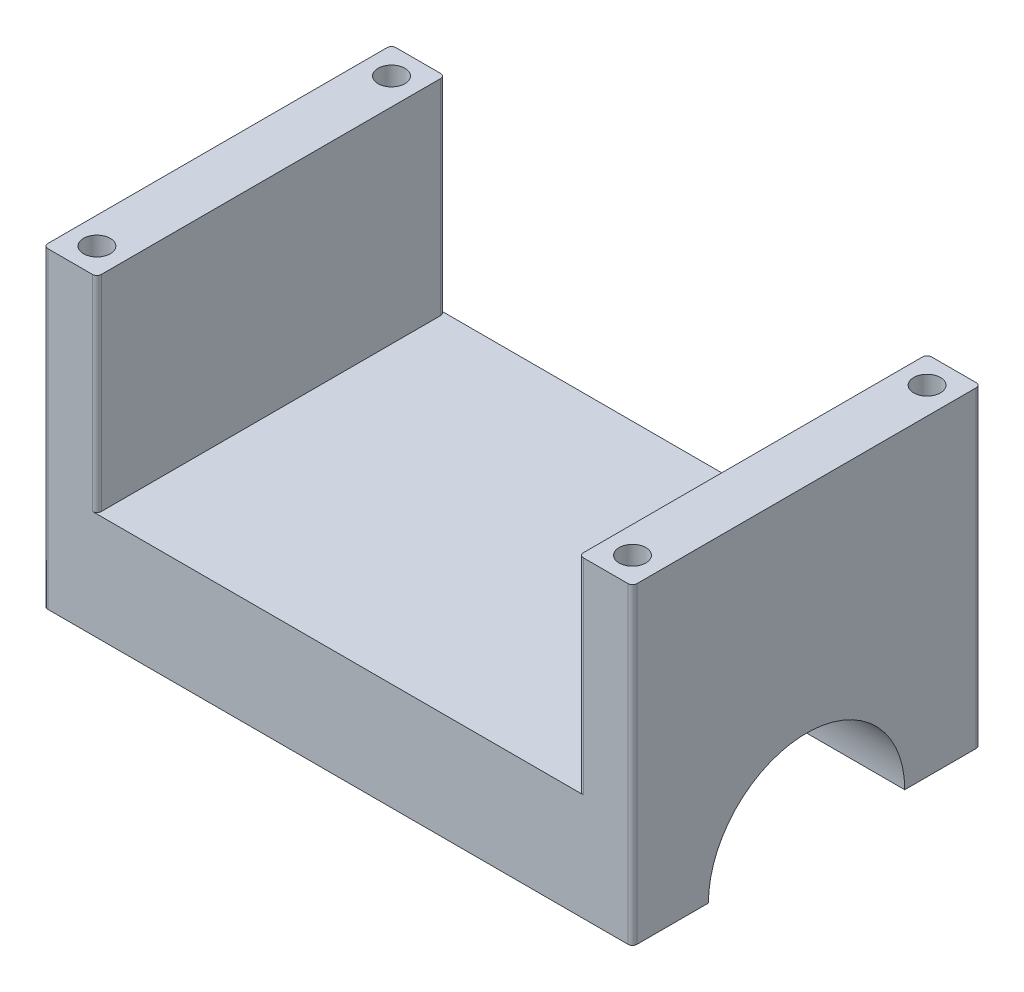
ISO-10303-21;
HEADER;
FILE_DESCRIPTION(('STEP AP214'),'2;1');
FILE_NAME('part.step','',(''),(''),'','','');
FILE_SCHEMA(('AUTOMOTIVE_DESIGN { 1 0 10303 214 1 1 1 1 }'));
ENDSEC;
DATA;
#1=APPLICATION_CONTEXT('core data for automotive mechanical design processes');
#2=APPLICATION_PROTOCOL_DEFINITION('international standard','automotive_design',2000,#1);
#3=PRODUCT_CONTEXT('',#1,'mechanical');
#4=PRODUCT('Part','Part','',(#3));
#5=PRODUCT_RELATED_PRODUCT_CATEGORY('part','',(#4));
#6=PRODUCT_DEFINITION_FORMATION('','',#4);
#7=PRODUCT_DEFINITION_CONTEXT('part definition',#1,'design');
#8=PRODUCT_DEFINITION('design','',#6,#7);
#9=PRODUCT_DEFINITION_SHAPE('','',#8);
#10=(LENGTH_UNIT() NAMED_UNIT(*) SI_UNIT(.MILLI.,.METRE.));
#11=(NAMED_UNIT(*) PLANE_ANGLE_UNIT() SI_UNIT($,.RADIAN.));
#12=(NAMED_UNIT(*) SI_UNIT($,.STERADIAN.) SOLID_ANGLE_UNIT());
#13=UNCERTAINTY_MEASURE_WITH_UNIT(LENGTH_MEASURE(1.E-05),#10,'distance_accuracy_value','');
#14=(GEOMETRIC_REPRESENTATION_CONTEXT(3) GLOBAL_UNCERTAINTY_ASSIGNED_CONTEXT((#13)) GLOBAL_UNIT_ASSIGNED_CONTEXT((#10,
#11,#12)) REPRESENTATION_CONTEXT('',''));
#15=CARTESIAN_POINT('',(0.,0.,0.));
#16=DIRECTION('',(0.,0.,1.));
#17=DIRECTION('',(1.,0.,0.));
#18=AXIS2_PLACEMENT_3D('',#15,#16,#17);
#19=CARTESIAN_POINT('',(0.,0.,0.));
#20=DIRECTION('',(0.,-1.,0.));
#21=DIRECTION('',(0.,0.,-1.));
#22=AXIS2_PLACEMENT_3D('',#19,#20,#21);
#23=PLANE('',#22);
#24=CARTESIAN_POINT('',(3.,0.,-36.));
#25=DIRECTION('',(0.,1.,0.));
#26=DIRECTION('',(0.,0.,1.));
#27=AXIS2_PLACEMENT_3D('',#24,#25,#26);
#28=CIRCLE('',#27,1.5);
#29=CARTESIAN_POINT('',(3.,0.,-34.5));
#30=VERTEX_POINT('',#29);
#31=EDGE_CURVE('E337',#30,#30,#28,.T.);
#32=ORIENTED_EDGE('',*,*,#31,.T.);
#33=EDGE_LOOP('',(#32));
#34=FACE_BOUND('',#33,.T.);
#35=CARTESIAN_POINT('',(63.,0.,-36.));
#36=DIRECTION('',(0.,1.,0.));
#37=DIRECTION('',(0.,0.,1.));
#38=AXIS2_PLACEMENT_3D('',#35,#36,#37);
#39=CIRCLE('',#38,1.5);
#40=CARTESIAN_POINT('',(63.,0.,-34.5));
#41=VERTEX_POINT('',#40);
#42=EDGE_CURVE('E343',#41,#41,#39,.T.);
#43=ORIENTED_EDGE('',*,*,#42,.T.);
#44=EDGE_LOOP('',(#43));
#45=FACE_BOUND('',#44,.T.);
#46=DIRECTION('',(-1.,0.,0.));
#47=VECTOR('',#46,1.);
#48=CARTESIAN_POINT('',(0.,0.,-39.));
#49=LINE('',#48,#47);
#50=CARTESIAN_POINT('',(65.5,0.,-39.));
#51=VERTEX_POINT('',#50);
#52=CARTESIAN_POINT('',(0.499999999999983,0.,-39.));
#53=VERTEX_POINT('',#52);
#54=EDGE_CURVE('E194',#51,#53,#49,.T.);
#55=ORIENTED_EDGE('',*,*,#54,.F.);
#56=CARTESIAN_POINT('',(65.5,0.,-38.5));
#57=DIRECTION('',(0.,-1.,0.));
#58=DIRECTION('',(0.,0.,-1.));
#59=AXIS2_PLACEMENT_3D('',#56,#57,#58);
#60=CIRCLE('',#59,0.5);
#61=CARTESIAN_POINT('',(66.,0.,-38.5));
#62=VERTEX_POINT('',#61);
#63=EDGE_CURVE('E191',#51,#62,#60,.T.);
#64=ORIENTED_EDGE('',*,*,#63,.T.);
#65=DIRECTION('',(0.,0.,-1.));
#66=VECTOR('',#65,1.);
#67=CARTESIAN_POINT('',(66.,0.,0.));
#68=LINE('',#67,#66);
#69=CARTESIAN_POINT('',(66.,0.,-30.5));
#70=VERTEX_POINT('',#69);
#71=EDGE_CURVE('E183',#70,#62,#68,.T.);
#72=ORIENTED_EDGE('',*,*,#71,.F.);
#73=DIRECTION('',(1.,0.,0.));
#74=VECTOR('',#73,1.);
#75=CARTESIAN_POINT('',(0.,0.,-30.5));
#76=LINE('',#75,#74);
#77=CARTESIAN_POINT('',(0.,0.,-30.5));
#78=VERTEX_POINT('',#77);
#79=EDGE_CURVE('E167',#78,#70,#76,.T.);
#80=ORIENTED_EDGE('',*,*,#79,.F.);
#81=DIRECTION('',(0.,0.,1.));
#82=VECTOR('',#81,1.);
#83=CARTESIAN_POINT('',(0.,0.,0.));
#84=LINE('',#83,#82);
#85=CARTESIAN_POINT('',(0.,0.,-38.5));
#86=VERTEX_POINT('',#85);
#87=EDGE_CURVE('E196',#86,#78,#84,.T.);
#88=ORIENTED_EDGE('',*,*,#87,.F.);
#89=CARTESIAN_POINT('',(0.499999999999983,0.,-38.5));
#90=DIRECTION('',(0.,-1.,0.));
#91=DIRECTION('',(0.,0.,-1.));
#92=AXIS2_PLACEMENT_3D('',#89,#90,#91);
#93=CIRCLE('',#92,0.5);
#94=EDGE_CURVE('E228',#86,#53,#93,.T.);
#95=ORIENTED_EDGE('',*,*,#94,.T.);
#96=EDGE_LOOP('',(#55,#64,#72,#80,#88,#95));
#97=FACE_BOUND('',#96,.T.);
#98=ADVANCED_FACE('F39',(#34,#45,#97),#23,.T.);
#99=CARTESIAN_POINT('',(0.,35.,0.));
#100=DIRECTION('',(0.,-1.,0.));
#101=DIRECTION('',(0.,0.,-1.));
#102=AXIS2_PLACEMENT_3D('',#99,#100,#101);
#103=PLANE('',#102);
#104=CARTESIAN_POINT('',(63.,35.,-36.));
#105=DIRECTION('',(0.,1.,0.));
#106=DIRECTION('',(0.,0.,1.));
#107=AXIS2_PLACEMENT_3D('',#104,#105,#106);
#108=CIRCLE('',#107,1.5);
#109=CARTESIAN_POINT('',(63.,35.,-34.5));
#110=VERTEX_POINT('',#109);
#111=EDGE_CURVE('E346',#110,#110,#108,.T.);
#112=ORIENTED_EDGE('',*,*,#111,.F.);
#113=EDGE_LOOP('',(#112));
#114=FACE_BOUND('',#113,.T.);
#115=CARTESIAN_POINT('',(63.,35.,-3.));
#116=DIRECTION('',(0.,1.,0.));
#117=DIRECTION('',(0.,0.,1.));
#118=AXIS2_PLACEMENT_3D('',#115,#116,#117);
#119=CIRCLE('',#118,1.5);
#120=CARTESIAN_POINT('',(63.,35.,-1.5));
#121=VERTEX_POINT('',#120);
#122=EDGE_CURVE('E334',#121,#121,#119,.T.);
#123=ORIENTED_EDGE('',*,*,#122,.F.);
#124=EDGE_LOOP('',(#123));
#125=FACE_BOUND('',#124,.T.);
#126=DIRECTION('',(-1.,0.,0.));
#127=VECTOR('',#126,1.);
#128=CARTESIAN_POINT('',(0.,35.,-39.));
#129=LINE('',#128,#127);
#130=CARTESIAN_POINT('',(65.5,35.,-39.));
#131=VERTEX_POINT('',#130);
#132=CARTESIAN_POINT('',(60.5,35.,-39.));
#133=VERTEX_POINT('',#132);
#134=EDGE_CURVE('E203',#131,#133,#129,.T.);
#135=ORIENTED_EDGE('',*,*,#134,.T.);
#136=CARTESIAN_POINT('',(60.5,35.,-38.5));
#137=DIRECTION('',(0.,-1.,0.));
#138=DIRECTION('',(0.,0.,-1.));
#139=AXIS2_PLACEMENT_3D('',#136,#137,#138);
#140=CIRCLE('',#139,0.5);
#141=CARTESIAN_POINT('',(60.,35.,-38.5));
#142=VERTEX_POINT('',#141);
#143=EDGE_CURVE('E221',#133,#142,#140,.F.);
#144=ORIENTED_EDGE('',*,*,#143,.T.);
#145=DIRECTION('',(0.,0.,-1.));
#146=VECTOR('',#145,1.);
#147=CARTESIAN_POINT('',(60.,35.,0.));
#148=LINE('',#147,#146);
#149=CARTESIAN_POINT('',(60.,35.,-0.5));
#150=VERTEX_POINT('',#149);
#151=EDGE_CURVE('E326',#150,#142,#148,.T.);
#152=ORIENTED_EDGE('',*,*,#151,.F.);
#153=CARTESIAN_POINT('',(60.5,35.,-0.5));
#154=DIRECTION('',(0.,-1.,0.));
#155=DIRECTION('',(0.,0.,-1.));
#156=AXIS2_PLACEMENT_3D('',#153,#154,#155);
#157=CIRCLE('',#156,0.5);
#158=CARTESIAN_POINT('',(60.5,35.,0.));
#159=VERTEX_POINT('',#158);
#160=EDGE_CURVE('E215',#150,#159,#157,.F.);
#161=ORIENTED_EDGE('',*,*,#160,.T.);
#162=DIRECTION('',(1.,0.,0.));
#163=VECTOR('',#162,1.);
#164=CARTESIAN_POINT('',(0.,35.,0.));
#165=LINE('',#164,#163);
#166=CARTESIAN_POINT('',(65.5,35.,0.));
#167=VERTEX_POINT('',#166);
#168=EDGE_CURVE('E316',#159,#167,#165,.T.);
#169=ORIENTED_EDGE('',*,*,#168,.T.);
#170=CARTESIAN_POINT('',(65.5,35.,-0.5));
#171=DIRECTION('',(0.,-1.,0.));
#172=DIRECTION('',(0.,0.,-1.));
#173=AXIS2_PLACEMENT_3D('',#170,#171,#172);
#174=CIRCLE('',#173,0.5);
#175=CARTESIAN_POINT('',(66.,35.,-0.5));
#176=VERTEX_POINT('',#175);
#177=EDGE_CURVE('E217',#167,#176,#174,.F.);
#178=ORIENTED_EDGE('',*,*,#177,.T.);
#179=DIRECTION('',(0.,0.,-1.));
#180=VECTOR('',#179,1.);
#181=CARTESIAN_POINT('',(66.,35.,0.));
#182=LINE('',#181,#180);
#183=CARTESIAN_POINT('',(66.,35.,-38.5));
#184=VERTEX_POINT('',#183);
#185=EDGE_CURVE('E296',#176,#184,#182,.T.);
#186=ORIENTED_EDGE('',*,*,#185,.T.);
#187=CARTESIAN_POINT('',(65.5,35.,-38.5));
#188=DIRECTION('',(0.,-1.,0.));
#189=DIRECTION('',(0.,0.,-1.));
#190=AXIS2_PLACEMENT_3D('',#187,#188,#189);
#191=CIRCLE('',#190,0.5);
#192=EDGE_CURVE('E219',#184,#131,#191,.F.);
#193=ORIENTED_EDGE('',*,*,#192,.T.);
#194=EDGE_LOOP('',(#135,#144,#152,#161,#169,#178,#186,#193));
#195=FACE_BOUND('',#194,.T.);
#196=ADVANCED_FACE('F357',(#114,#125,#195),#103,.F.);
#197=CARTESIAN_POINT('',(0.,35.,0.));
#198=DIRECTION('',(1.,0.,0.));
#199=DIRECTION('',(0.,0.,-1.));
#200=AXIS2_PLACEMENT_3D('',#197,#198,#199);
#201=PLANE('',#200);
#202=CARTESIAN_POINT('',(0.,0.,-8.50000000000001));
#203=VERTEX_POINT('',#202);
#204=CARTESIAN_POINT('',(0.,0.,-0.5));
#205=VERTEX_POINT('',#204);
#206=EDGE_CURVE('E286',#203,#205,#84,.T.);
#207=ORIENTED_EDGE('',*,*,#206,.T.);
#208=DIRECTION('',(0.,-1.,0.));
#209=VECTOR('',#208,1.);
#210=CARTESIAN_POINT('',(0.,35.,-0.5));
#211=LINE('',#210,#209);
#212=CARTESIAN_POINT('',(0.,35.,-0.5));
#213=VERTEX_POINT('',#212);
#214=EDGE_CURVE('E54',#205,#213,#211,.F.);
#215=ORIENTED_EDGE('',*,*,#214,.T.);
#216=DIRECTION('',(0.,0.,1.));
#217=VECTOR('',#216,1.);
#218=CARTESIAN_POINT('',(0.,35.,0.));
#219=LINE('',#218,#217);
#220=CARTESIAN_POINT('',(0.,35.,-38.5));
#221=VERTEX_POINT('',#220);
#222=EDGE_CURVE('E202',#221,#213,#219,.T.);
#223=ORIENTED_EDGE('',*,*,#222,.F.);
#224=DIRECTION('',(0.,-1.,0.));
#225=VECTOR('',#224,1.);
#226=CARTESIAN_POINT('',(0.,35.,-38.5));
#227=LINE('',#226,#225);
#228=EDGE_CURVE('E262',#221,#86,#227,.T.);
#229=ORIENTED_EDGE('',*,*,#228,.T.);
#230=ORIENTED_EDGE('',*,*,#87,.T.);
#231=CARTESIAN_POINT('',(0.,0.,-19.5));
#232=DIRECTION('',(1.,0.,0.));
#233=DIRECTION('',(0.,0.,-1.));
#234=AXIS2_PLACEMENT_3D('',#231,#232,#233);
#235=CIRCLE('',#234,11.);
#236=EDGE_CURVE('E173',#78,#203,#235,.T.);
#237=ORIENTED_EDGE('',*,*,#236,.T.);
#238=EDGE_LOOP('',(#207,#215,#223,#229,#230,#237));
#239=FACE_BOUND('',#238,.T.);
#240=ADVANCED_FACE('F304',(#239),#201,.F.);
#241=CARTESIAN_POINT('',(0.,35.,0.));
#242=DIRECTION('',(0.,0.,-1.));
#243=DIRECTION('',(-1.,0.,0.));
#244=AXIS2_PLACEMENT_3D('',#241,#242,#243);
#245=PLANE('',#244);
#246=DIRECTION('',(1.,0.,0.));
#247=VECTOR('',#246,1.);
#248=CARTESIAN_POINT('',(0.,0.,0.));
#249=LINE('',#248,#247);
#250=CARTESIAN_POINT('',(0.5,0.,0.));
#251=VERTEX_POINT('',#250);
#252=CARTESIAN_POINT('',(65.5,0.,0.));
#253=VERTEX_POINT('',#252);
#254=EDGE_CURVE('E192',#251,#253,#249,.T.);
#255=ORIENTED_EDGE('',*,*,#254,.T.);
#256=DIRECTION('',(0.,-1.,0.));
#257=VECTOR('',#256,1.);
#258=CARTESIAN_POINT('',(65.5,35.,0.));
#259=LINE('',#258,#257);
#260=EDGE_CURVE('E248',#253,#167,#259,.F.);
#261=ORIENTED_EDGE('',*,*,#260,.T.);
#262=ORIENTED_EDGE('',*,*,#168,.F.);
#263=DIRECTION('',(0.,1.,0.));
#264=VECTOR('',#263,1.);
#265=CARTESIAN_POINT('',(60.5,35.,0.));
#266=LINE('',#265,#264);
#267=CARTESIAN_POINT('',(60.5,12.,0.));
#268=VERTEX_POINT('',#267);
#269=EDGE_CURVE('E245',#159,#268,#266,.F.);
#270=ORIENTED_EDGE('',*,*,#269,.T.);
#271=DIRECTION('',(1.,0.,0.));
#272=VECTOR('',#271,1.);
#273=CARTESIAN_POINT('',(6.,12.,0.));
#274=LINE('',#273,#272);
#275=CARTESIAN_POINT('',(5.5,12.,0.));
#276=VERTEX_POINT('',#275);
#277=EDGE_CURVE('E323',#276,#268,#274,.T.);
#278=ORIENTED_EDGE('',*,*,#277,.F.);
#279=DIRECTION('',(0.,1.,0.));
#280=VECTOR('',#279,1.);
#281=CARTESIAN_POINT('',(5.5,35.,0.));
#282=LINE('',#281,#280);
#283=CARTESIAN_POINT('',(5.5,35.,0.));
#284=VERTEX_POINT('',#283);
#285=EDGE_CURVE('E242',#276,#284,#282,.T.);
#286=ORIENTED_EDGE('',*,*,#285,.T.);
#287=CARTESIAN_POINT('',(0.5,35.,0.));
#288=VERTEX_POINT('',#287);
#289=EDGE_CURVE('E300',#288,#284,#165,.T.);
#290=ORIENTED_EDGE('',*,*,#289,.F.);
#291=DIRECTION('',(0.,-1.,0.));
#292=VECTOR('',#291,1.);
#293=CARTESIAN_POINT('',(0.5,35.,0.));
#294=LINE('',#293,#292);
#295=EDGE_CURVE('E239',#288,#251,#294,.T.);
#296=ORIENTED_EDGE('',*,*,#295,.T.);
#297=EDGE_LOOP('',(#255,#261,#262,#270,#278,#286,#290,#296));
#298=FACE_BOUND('',#297,.T.);
#299=ADVANCED_FACE('F313',(#298),#245,.F.);
#300=CARTESIAN_POINT('',(66.,35.,0.));
#301=DIRECTION('',(-1.,0.,0.));
#302=DIRECTION('',(0.,0.,1.));
#303=AXIS2_PLACEMENT_3D('',#300,#301,#302);
#304=PLANE('',#303);
#305=ORIENTED_EDGE('',*,*,#71,.T.);
#306=DIRECTION('',(0.,-1.,0.));
#307=VECTOR('',#306,1.);
#308=CARTESIAN_POINT('',(66.,35.,-38.5));
#309=LINE('',#308,#307);
#310=EDGE_CURVE('E233',#62,#184,#309,.F.);
#311=ORIENTED_EDGE('',*,*,#310,.T.);
#312=ORIENTED_EDGE('',*,*,#185,.F.);
#313=DIRECTION('',(0.,-1.,0.));
#314=VECTOR('',#313,1.);
#315=CARTESIAN_POINT('',(66.,35.,-0.5));
#316=LINE('',#315,#314);
#317=CARTESIAN_POINT('',(66.,0.,-0.5));
#318=VERTEX_POINT('',#317);
#319=EDGE_CURVE('E231',#176,#318,#316,.T.);
#320=ORIENTED_EDGE('',*,*,#319,.T.);
#321=CARTESIAN_POINT('',(66.,0.,-8.50000000000001));
#322=VERTEX_POINT('',#321);
#323=EDGE_CURVE('E187',#318,#322,#68,.T.);
#324=ORIENTED_EDGE('',*,*,#323,.T.);
#325=CARTESIAN_POINT('',(66.,0.,-19.5));
#326=DIRECTION('',(1.,0.,0.));
#327=DIRECTION('',(0.,0.,-1.));
#328=AXIS2_PLACEMENT_3D('',#325,#326,#327);
#329=CIRCLE('',#328,11.);
#330=EDGE_CURVE('E170',#70,#322,#329,.T.);
#331=ORIENTED_EDGE('',*,*,#330,.F.);
#332=EDGE_LOOP('',(#305,#311,#312,#320,#324,#331));
#333=FACE_BOUND('',#332,.T.);
#334=ADVANCED_FACE('F182',(#333),#304,.F.);
#335=CARTESIAN_POINT('',(0.,35.,-39.));
#336=DIRECTION('',(0.,0.,1.));
#337=DIRECTION('',(1.,0.,0.));
#338=AXIS2_PLACEMENT_3D('',#335,#336,#337);
#339=PLANE('',#338);
#340=DIRECTION('',(-1.,0.,0.));
#341=VECTOR('',#340,1.);
#342=CARTESIAN_POINT('',(6.,12.,-39.));
#343=LINE('',#342,#341);
#344=CARTESIAN_POINT('',(60.5,12.,-39.));
#345=VERTEX_POINT('',#344);
#346=CARTESIAN_POINT('',(5.5,12.,-39.));
#347=VERTEX_POINT('',#346);
#348=EDGE_CURVE('E277',#345,#347,#343,.T.);
#349=ORIENTED_EDGE('',*,*,#348,.F.);
#350=DIRECTION('',(0.,1.,0.));
#351=VECTOR('',#350,1.);
#352=CARTESIAN_POINT('',(60.5,35.,-39.));
#353=LINE('',#352,#351);
#354=EDGE_CURVE('E212',#345,#133,#353,.T.);
#355=ORIENTED_EDGE('',*,*,#354,.T.);
#356=ORIENTED_EDGE('',*,*,#134,.F.);
#357=DIRECTION('',(0.,-1.,0.));
#358=VECTOR('',#357,1.);
#359=CARTESIAN_POINT('',(65.5,35.,-39.));
#360=LINE('',#359,#358);
#361=EDGE_CURVE('E209',#131,#51,#360,.T.);
#362=ORIENTED_EDGE('',*,*,#361,.T.);
#363=ORIENTED_EDGE('',*,*,#54,.T.);
#364=DIRECTION('',(0.,-1.,0.));
#365=VECTOR('',#364,1.);
#366=CARTESIAN_POINT('',(0.499999999999983,35.,-39.));
#367=LINE('',#366,#365);
#368=CARTESIAN_POINT('',(0.499999999999983,35.,-39.));
#369=VERTEX_POINT('',#368);
#370=EDGE_CURVE('E177',#53,#369,#367,.F.);
#371=ORIENTED_EDGE('',*,*,#370,.T.);
#372=CARTESIAN_POINT('',(5.5,35.,-39.));
#373=VERTEX_POINT('',#372);
#374=EDGE_CURVE('E291',#373,#369,#129,.T.);
#375=ORIENTED_EDGE('',*,*,#374,.F.);
#376=DIRECTION('',(0.,1.,0.));
#377=VECTOR('',#376,1.);
#378=CARTESIAN_POINT('',(5.5,35.,-39.));
#379=LINE('',#378,#377);
#380=EDGE_CURVE('E206',#373,#347,#379,.F.);
#381=ORIENTED_EDGE('',*,*,#380,.T.);
#382=EDGE_LOOP('',(#349,#355,#356,#362,#363,#371,#375,#381));
#383=FACE_BOUND('',#382,.T.);
#384=ADVANCED_FACE('F294',(#383),#339,.F.);
#385=CARTESIAN_POINT('',(3.,35.,-36.));
#386=DIRECTION('',(0.,1.,0.));
#387=DIRECTION('',(0.,0.,1.));
#388=AXIS2_PLACEMENT_3D('',#385,#386,#387);
#389=CIRCLE('',#388,1.5);
#390=CARTESIAN_POINT('',(3.,35.,-34.5));
#391=VERTEX_POINT('',#390);
#392=EDGE_CURVE('E340',#391,#391,#389,.T.);
#393=ORIENTED_EDGE('',*,*,#392,.F.);
#394=EDGE_LOOP('',(#393));
#395=FACE_BOUND('',#394,.T.);
#396=CARTESIAN_POINT('',(3.,35.,-3.));
#397=DIRECTION('',(0.,1.,0.));
#398=DIRECTION('',(0.,0.,1.));
#399=AXIS2_PLACEMENT_3D('',#396,#397,#398);
#400=CIRCLE('',#399,1.5);
#401=CARTESIAN_POINT('',(3.,35.,-1.5));
#402=VERTEX_POINT('',#401);
#403=EDGE_CURVE('E331',#402,#402,#400,.T.);
#404=ORIENTED_EDGE('',*,*,#403,.F.);
#405=EDGE_LOOP('',(#404));
#406=FACE_BOUND('',#405,.T.);
#407=DIRECTION('',(0.,0.,1.));
#408=VECTOR('',#407,1.);
#409=CARTESIAN_POINT('',(6.,35.,0.));
#410=LINE('',#409,#408);
#411=CARTESIAN_POINT('',(6.,35.,-38.5));
#412=VERTEX_POINT('',#411);
#413=CARTESIAN_POINT('',(6.,35.,-0.5));
#414=VERTEX_POINT('',#413);
#415=EDGE_CURVE('E292',#412,#414,#410,.T.);
#416=ORIENTED_EDGE('',*,*,#415,.F.);
#417=CARTESIAN_POINT('',(5.5,35.,-38.5));
#418=DIRECTION('',(0.,-1.,0.));
#419=DIRECTION('',(0.,0.,-1.));
#420=AXIS2_PLACEMENT_3D('',#417,#418,#419);
#421=CIRCLE('',#420,0.5);
#422=EDGE_CURVE('E260',#412,#373,#421,.F.);
#423=ORIENTED_EDGE('',*,*,#422,.T.);
#424=ORIENTED_EDGE('',*,*,#374,.T.);
#425=CARTESIAN_POINT('',(0.499999999999983,35.,-38.5));
#426=DIRECTION('',(0.,-1.,0.));
#427=DIRECTION('',(0.,0.,-1.));
#428=AXIS2_PLACEMENT_3D('',#425,#426,#427);
#429=CIRCLE('',#428,0.5);
#430=EDGE_CURVE('E61',#369,#221,#429,.F.);
#431=ORIENTED_EDGE('',*,*,#430,.T.);
#432=ORIENTED_EDGE('',*,*,#222,.T.);
#433=CARTESIAN_POINT('',(0.5,35.,-0.5));
#434=DIRECTION('',(0.,-1.,0.));
#435=DIRECTION('',(0.,0.,-1.));
#436=AXIS2_PLACEMENT_3D('',#433,#434,#435);
#437=CIRCLE('',#436,0.5);
#438=EDGE_CURVE('E256',#213,#288,#437,.F.);
#439=ORIENTED_EDGE('',*,*,#438,.T.);
#440=ORIENTED_EDGE('',*,*,#289,.T.);
#441=CARTESIAN_POINT('',(5.5,35.,-0.5));
#442=DIRECTION('',(0.,-1.,0.));
#443=DIRECTION('',(0.,0.,-1.));
#444=AXIS2_PLACEMENT_3D('',#441,#442,#443);
#445=CIRCLE('',#444,0.5);
#446=EDGE_CURVE('E258',#284,#414,#445,.F.);
#447=ORIENTED_EDGE('',*,*,#446,.T.);
#448=EDGE_LOOP('',(#416,#423,#424,#431,#432,#439,#440,#447));
#449=FACE_BOUND('',#448,.T.);
#450=ADVANCED_FACE('F290',(#395,#406,#449),#103,.F.);
#451=CARTESIAN_POINT('',(63.,0.,-3.));
#452=DIRECTION('',(0.,1.,0.));
#453=DIRECTION('',(0.,0.,1.));
#454=AXIS2_PLACEMENT_3D('',#451,#452,#453);
#455=CIRCLE('',#454,1.5);
#456=CARTESIAN_POINT('',(63.,0.,-1.5));
#457=VERTEX_POINT('',#456);
#458=EDGE_CURVE('E349',#457,#457,#455,.T.);
#459=ORIENTED_EDGE('',*,*,#458,.T.);
#460=EDGE_LOOP('',(#459));
#461=FACE_BOUND('',#460,.T.);
#462=CARTESIAN_POINT('',(3.,0.,-3.));
#463=DIRECTION('',(0.,1.,0.));
#464=DIRECTION('',(0.,0.,1.));
#465=AXIS2_PLACEMENT_3D('',#462,#463,#464);
#466=CIRCLE('',#465,1.5);
#467=CARTESIAN_POINT('',(3.,0.,-1.5));
#468=VERTEX_POINT('',#467);
#469=EDGE_CURVE('E188',#468,#468,#466,.T.);
#470=ORIENTED_EDGE('',*,*,#469,.T.);
#471=EDGE_LOOP('',(#470));
#472=FACE_BOUND('',#471,.T.);
#473=ORIENTED_EDGE('',*,*,#323,.F.);
#474=CARTESIAN_POINT('',(65.5,0.,-0.5));
#475=DIRECTION('',(0.,-1.,0.));
#476=DIRECTION('',(0.,0.,-1.));
#477=AXIS2_PLACEMENT_3D('',#474,#475,#476);
#478=CIRCLE('',#477,0.5);
#479=EDGE_CURVE('E237',#318,#253,#478,.T.);
#480=ORIENTED_EDGE('',*,*,#479,.T.);
#481=ORIENTED_EDGE('',*,*,#254,.F.);
#482=CARTESIAN_POINT('',(0.5,0.,-0.5));
#483=DIRECTION('',(0.,-1.,0.));
#484=DIRECTION('',(0.,0.,-1.));
#485=AXIS2_PLACEMENT_3D('',#482,#483,#484);
#486=CIRCLE('',#485,0.5);
#487=EDGE_CURVE('E235',#251,#205,#486,.T.);
#488=ORIENTED_EDGE('',*,*,#487,.T.);
#489=ORIENTED_EDGE('',*,*,#206,.F.);
#490=DIRECTION('',(1.,0.,0.));
#491=VECTOR('',#490,1.);
#492=CARTESIAN_POINT('',(0.,0.,-8.50000000000001));
#493=LINE('',#492,#491);
#494=EDGE_CURVE('E178',#322,#203,#493,.F.);
#495=ORIENTED_EDGE('',*,*,#494,.F.);
#496=EDGE_LOOP('',(#473,#480,#481,#488,#489,#495));
#497=FACE_BOUND('',#496,.T.);
#498=ADVANCED_FACE('F376',(#461,#472,#497),#23,.T.);
#499=CARTESIAN_POINT('',(0.,12.,0.));
#500=DIRECTION('',(0.,-1.,0.));
#501=DIRECTION('',(0.,0.,-1.));
#502=AXIS2_PLACEMENT_3D('',#499,#500,#501);
#503=PLANE('',#502);
#504=ORIENTED_EDGE('',*,*,#348,.T.);
#505=CARTESIAN_POINT('',(5.5,12.,-38.5));
#506=DIRECTION('',(0.,-1.,0.));
#507=DIRECTION('',(0.,0.,-1.));
#508=AXIS2_PLACEMENT_3D('',#505,#506,#507);
#509=CIRCLE('',#508,0.5);
#510=CARTESIAN_POINT('',(6.,12.,-38.5));
#511=VERTEX_POINT('',#510);
#512=EDGE_CURVE('E47',#347,#511,#509,.T.);
#513=ORIENTED_EDGE('',*,*,#512,.T.);
#514=DIRECTION('',(0.,0.,1.));
#515=VECTOR('',#514,1.);
#516=CARTESIAN_POINT('',(6.,12.,0.));
#517=LINE('',#516,#515);
#518=CARTESIAN_POINT('',(6.,12.,-0.5));
#519=VERTEX_POINT('',#518);
#520=EDGE_CURVE('E275',#511,#519,#517,.T.);
#521=ORIENTED_EDGE('',*,*,#520,.T.);
#522=CARTESIAN_POINT('',(5.5,12.,-0.5));
#523=DIRECTION('',(0.,-1.,0.));
#524=DIRECTION('',(0.,0.,-1.));
#525=AXIS2_PLACEMENT_3D('',#522,#523,#524);
#526=CIRCLE('',#525,0.5);
#527=EDGE_CURVE('E12',#519,#276,#526,.T.);
#528=ORIENTED_EDGE('',*,*,#527,.T.);
#529=ORIENTED_EDGE('',*,*,#277,.T.);
#530=CARTESIAN_POINT('',(60.5,12.,-0.5));
#531=DIRECTION('',(0.,-1.,0.));
#532=DIRECTION('',(0.,0.,-1.));
#533=AXIS2_PLACEMENT_3D('',#530,#531,#532);
#534=CIRCLE('',#533,0.5);
#535=CARTESIAN_POINT('',(60.,12.,-0.5));
#536=VERTEX_POINT('',#535);
#537=EDGE_CURVE('E269',#268,#536,#534,.T.);
#538=ORIENTED_EDGE('',*,*,#537,.T.);
#539=DIRECTION('',(0.,0.,-1.));
#540=VECTOR('',#539,1.);
#541=CARTESIAN_POINT('',(60.,12.,0.));
#542=LINE('',#541,#540);
#543=CARTESIAN_POINT('',(60.,12.,-38.5));
#544=VERTEX_POINT('',#543);
#545=EDGE_CURVE('E320',#536,#544,#542,.T.);
#546=ORIENTED_EDGE('',*,*,#545,.T.);
#547=CARTESIAN_POINT('',(60.5,12.,-38.5));
#548=DIRECTION('',(0.,-1.,0.));
#549=DIRECTION('',(0.,0.,-1.));
#550=AXIS2_PLACEMENT_3D('',#547,#548,#549);
#551=CIRCLE('',#550,0.5);
#552=EDGE_CURVE('E266',#544,#345,#551,.T.);
#553=ORIENTED_EDGE('',*,*,#552,.T.);
#554=EDGE_LOOP('',(#504,#513,#521,#528,#529,#538,#546,#553));
#555=FACE_BOUND('',#554,.T.);
#556=ADVANCED_FACE('F274',(#555),#503,.F.);
#557=CARTESIAN_POINT('',(60.,-77.6108099335235,0.));
#558=DIRECTION('',(1.,0.,0.));
#559=DIRECTION('',(0.,0.,-1.));
#560=AXIS2_PLACEMENT_3D('',#557,#558,#559);
#561=PLANE('',#560);
#562=ORIENTED_EDGE('',*,*,#151,.T.);
#563=DIRECTION('',(0.,1.,0.));
#564=VECTOR('',#563,1.);
#565=CARTESIAN_POINT('',(60.,-77.6108099335235,-38.5));
#566=LINE('',#565,#564);
#567=EDGE_CURVE('E226',#142,#544,#566,.F.);
#568=ORIENTED_EDGE('',*,*,#567,.T.);
#569=ORIENTED_EDGE('',*,*,#545,.F.);
#570=DIRECTION('',(0.,1.,0.));
#571=VECTOR('',#570,1.);
#572=CARTESIAN_POINT('',(60.,-77.6108099335235,-0.5));
#573=LINE('',#572,#571);
#574=EDGE_CURVE('E223',#536,#150,#573,.T.);
#575=ORIENTED_EDGE('',*,*,#574,.T.);
#576=EDGE_LOOP('',(#562,#568,#569,#575));
#577=FACE_BOUND('',#576,.T.);
#578=ADVANCED_FACE('F385',(#577),#561,.F.);
#579=CARTESIAN_POINT('',(6.,-77.6108099335235,0.));
#580=DIRECTION('',(-1.,0.,0.));
#581=DIRECTION('',(0.,0.,1.));
#582=AXIS2_PLACEMENT_3D('',#579,#580,#581);
#583=PLANE('',#582);
#584=ORIENTED_EDGE('',*,*,#520,.F.);
#585=DIRECTION('',(0.,1.,0.));
#586=VECTOR('',#585,1.);
#587=CARTESIAN_POINT('',(6.,-77.6108099335235,-38.5));
#588=LINE('',#587,#586);
#589=EDGE_CURVE('E252',#511,#412,#588,.T.);
#590=ORIENTED_EDGE('',*,*,#589,.T.);
#591=ORIENTED_EDGE('',*,*,#415,.T.);
#592=DIRECTION('',(0.,1.,0.));
#593=VECTOR('',#592,1.);
#594=CARTESIAN_POINT('',(6.,-77.6108099335235,-0.5));
#595=LINE('',#594,#593);
#596=EDGE_CURVE('E250',#414,#519,#595,.F.);
#597=ORIENTED_EDGE('',*,*,#596,.T.);
#598=EDGE_LOOP('',(#584,#590,#591,#597));
#599=FACE_BOUND('',#598,.T.);
#600=ADVANCED_FACE('F282',(#599),#583,.F.);
#601=CARTESIAN_POINT('',(0.,0.,-19.5));
#602=DIRECTION('',(1.,0.,0.));
#603=DIRECTION('',(0.,0.,-1.));
#604=AXIS2_PLACEMENT_3D('',#601,#602,#603);
#605=CYLINDRICAL_SURFACE('',#604,11.);
#606=ORIENTED_EDGE('',*,*,#79,.T.);
#607=ORIENTED_EDGE('',*,*,#330,.T.);
#608=ORIENTED_EDGE('',*,*,#494,.T.);
#609=ORIENTED_EDGE('',*,*,#236,.F.);
#610=EDGE_LOOP('',(#606,#607,#608,#609));
#611=FACE_BOUND('',#610,.T.);
#612=ADVANCED_FACE('F169',(#611),#605,.F.);
#613=CARTESIAN_POINT('',(3.,0.,-3.));
#614=DIRECTION('',(0.,1.,0.));
#615=DIRECTION('',(0.,0.,1.));
#616=AXIS2_PLACEMENT_3D('',#613,#614,#615);
#617=CYLINDRICAL_SURFACE('',#616,1.5);
#618=ORIENTED_EDGE('',*,*,#469,.F.);
#619=EDGE_LOOP('',(#618));
#620=FACE_BOUND('',#619,.T.);
#621=ORIENTED_EDGE('',*,*,#403,.T.);
#622=EDGE_LOOP('',(#621));
#623=FACE_BOUND('',#622,.T.);
#624=ADVANCED_FACE('F420',(#620,#623),#617,.F.);
#625=CARTESIAN_POINT('',(63.,0.,-3.));
#626=DIRECTION('',(0.,1.,0.));
#627=DIRECTION('',(0.,0.,1.));
#628=AXIS2_PLACEMENT_3D('',#625,#626,#627);
#629=CYLINDRICAL_SURFACE('',#628,1.5);
#630=ORIENTED_EDGE('',*,*,#458,.F.);
#631=EDGE_LOOP('',(#630));
#632=FACE_BOUND('',#631,.T.);
#633=ORIENTED_EDGE('',*,*,#122,.T.);
#634=EDGE_LOOP('',(#633));
#635=FACE_BOUND('',#634,.T.);
#636=ADVANCED_FACE('F355',(#632,#635),#629,.F.);
#637=CARTESIAN_POINT('',(3.,0.,-36.));
#638=DIRECTION('',(0.,1.,0.));
#639=DIRECTION('',(0.,0.,1.));
#640=AXIS2_PLACEMENT_3D('',#637,#638,#639);
#641=CYLINDRICAL_SURFACE('',#640,1.5);
#642=ORIENTED_EDGE('',*,*,#31,.F.);
#643=EDGE_LOOP('',(#642));
#644=FACE_BOUND('',#643,.T.);
#645=ORIENTED_EDGE('',*,*,#392,.T.);
#646=EDGE_LOOP('',(#645));
#647=FACE_BOUND('',#646,.T.);
#648=ADVANCED_FACE('F397',(#644,#647),#641,.F.);
#649=CARTESIAN_POINT('',(63.,0.,-36.));
#650=DIRECTION('',(0.,1.,0.));
#651=DIRECTION('',(0.,0.,1.));
#652=AXIS2_PLACEMENT_3D('',#649,#650,#651);
#653=CYLINDRICAL_SURFACE('',#652,1.5);
#654=ORIENTED_EDGE('',*,*,#42,.F.);
#655=EDGE_LOOP('',(#654));
#656=FACE_BOUND('',#655,.T.);
#657=ORIENTED_EDGE('',*,*,#111,.T.);
#658=EDGE_LOOP('',(#657));
#659=FACE_BOUND('',#658,.T.);
#660=ADVANCED_FACE('F390',(#656,#659),#653,.F.);
#661=CARTESIAN_POINT('',(60.5,35.,-38.5));
#662=DIRECTION('',(0.,1.,0.));
#663=DIRECTION('',(0.,0.,1.));
#664=AXIS2_PLACEMENT_3D('',#661,#662,#663);
#665=CYLINDRICAL_SURFACE('',#664,0.5);
#666=ORIENTED_EDGE('',*,*,#552,.F.);
#667=ORIENTED_EDGE('',*,*,#567,.F.);
#668=ORIENTED_EDGE('',*,*,#143,.F.);
#669=ORIENTED_EDGE('',*,*,#354,.F.);
#670=EDGE_LOOP('',(#666,#667,#668,#669));
#671=FACE_BOUND('',#670,.T.);
#672=ADVANCED_FACE('F388',(#671),#665,.T.);
#673=CARTESIAN_POINT('',(65.5,35.,-38.5));
#674=DIRECTION('',(0.,-1.,0.));
#675=DIRECTION('',(0.,0.,-1.));
#676=AXIS2_PLACEMENT_3D('',#673,#674,#675);
#677=CYLINDRICAL_SURFACE('',#676,0.5);
#678=ORIENTED_EDGE('',*,*,#192,.F.);
#679=ORIENTED_EDGE('',*,*,#310,.F.);
#680=ORIENTED_EDGE('',*,*,#63,.F.);
#681=ORIENTED_EDGE('',*,*,#361,.F.);
#682=EDGE_LOOP('',(#678,#679,#680,#681));
#683=FACE_BOUND('',#682,.T.);
#684=ADVANCED_FACE('F368',(#683),#677,.T.);
#685=CARTESIAN_POINT('',(65.5,35.,-0.5));
#686=DIRECTION('',(0.,-1.,0.));
#687=DIRECTION('',(0.,0.,-1.));
#688=AXIS2_PLACEMENT_3D('',#685,#686,#687);
#689=CYLINDRICAL_SURFACE('',#688,0.5);
#690=ORIENTED_EDGE('',*,*,#177,.F.);
#691=ORIENTED_EDGE('',*,*,#260,.F.);
#692=ORIENTED_EDGE('',*,*,#479,.F.);
#693=ORIENTED_EDGE('',*,*,#319,.F.);
#694=EDGE_LOOP('',(#690,#691,#692,#693));
#695=FACE_BOUND('',#694,.T.);
#696=ADVANCED_FACE('F375',(#695),#689,.T.);
#697=CARTESIAN_POINT('',(60.5,-77.6108099335235,-0.5));
#698=DIRECTION('',(0.,1.,0.));
#699=DIRECTION('',(0.,0.,1.));
#700=AXIS2_PLACEMENT_3D('',#697,#698,#699);
#701=CYLINDRICAL_SURFACE('',#700,0.5);
#702=ORIENTED_EDGE('',*,*,#537,.F.);
#703=ORIENTED_EDGE('',*,*,#269,.F.);
#704=ORIENTED_EDGE('',*,*,#160,.F.);
#705=ORIENTED_EDGE('',*,*,#574,.F.);
#706=EDGE_LOOP('',(#702,#703,#704,#705));
#707=FACE_BOUND('',#706,.T.);
#708=ADVANCED_FACE('F380',(#707),#701,.T.);
#709=CARTESIAN_POINT('',(5.5,-77.6108099335235,-38.5));
#710=DIRECTION('',(0.,1.,0.));
#711=DIRECTION('',(0.,0.,1.));
#712=AXIS2_PLACEMENT_3D('',#709,#710,#711);
#713=CYLINDRICAL_SURFACE('',#712,0.5);
#714=ORIENTED_EDGE('',*,*,#512,.F.);
#715=ORIENTED_EDGE('',*,*,#380,.F.);
#716=ORIENTED_EDGE('',*,*,#422,.F.);
#717=ORIENTED_EDGE('',*,*,#589,.F.);
#718=EDGE_LOOP('',(#714,#715,#716,#717));
#719=FACE_BOUND('',#718,.T.);
#720=ADVANCED_FACE('F288',(#719),#713,.T.);
#721=CARTESIAN_POINT('',(5.5,35.,-0.5));
#722=DIRECTION('',(0.,1.,0.));
#723=DIRECTION('',(0.,0.,1.));
#724=AXIS2_PLACEMENT_3D('',#721,#722,#723);
#725=CYLINDRICAL_SURFACE('',#724,0.5);
#726=ORIENTED_EDGE('',*,*,#527,.F.);
#727=ORIENTED_EDGE('',*,*,#596,.F.);
#728=ORIENTED_EDGE('',*,*,#446,.F.);
#729=ORIENTED_EDGE('',*,*,#285,.F.);
#730=EDGE_LOOP('',(#726,#727,#728,#729));
#731=FACE_BOUND('',#730,.T.);
#732=ADVANCED_FACE('F565',(#731),#725,.T.);
#733=CARTESIAN_POINT('',(0.5,35.,-0.5));
#734=DIRECTION('',(0.,-1.,0.));
#735=DIRECTION('',(0.,0.,-1.));
#736=AXIS2_PLACEMENT_3D('',#733,#734,#735);
#737=CYLINDRICAL_SURFACE('',#736,0.5);
#738=ORIENTED_EDGE('',*,*,#438,.F.);
#739=ORIENTED_EDGE('',*,*,#214,.F.);
#740=ORIENTED_EDGE('',*,*,#487,.F.);
#741=ORIENTED_EDGE('',*,*,#295,.F.);
#742=EDGE_LOOP('',(#738,#739,#740,#741));
#743=FACE_BOUND('',#742,.T.);
#744=ADVANCED_FACE('F308',(#743),#737,.T.);
#745=CARTESIAN_POINT('',(0.499999999999983,35.,-38.5));
#746=DIRECTION('',(0.,-1.,0.));
#747=DIRECTION('',(0.,0.,-1.));
#748=AXIS2_PLACEMENT_3D('',#745,#746,#747);
#749=CYLINDRICAL_SURFACE('',#748,0.5);
#750=ORIENTED_EDGE('',*,*,#430,.F.);
#751=ORIENTED_EDGE('',*,*,#370,.F.);
#752=ORIENTED_EDGE('',*,*,#94,.F.);
#753=ORIENTED_EDGE('',*,*,#228,.F.);
#754=EDGE_LOOP('',(#750,#751,#752,#753));
#755=FACE_BOUND('',#754,.T.);
#756=ADVANCED_FACE('F41',(#755),#749,.T.);
#757=CLOSED_SHELL('',(#98,#196,#240,#299,#334,#384,#450,#498,#556,#578,#600,#612,#624,#636,#648,
#660,#672,#684,#696,#708,#720,#732,#744,#756));
#758=MANIFOLD_SOLID_BREP('B2',#757);
#759=ADVANCED_BREP_SHAPE_REPRESENTATION('',(#18,#758),#14);
#760=SHAPE_DEFINITION_REPRESENTATION(#9,#759);
ENDSEC;
END-ISO-10303-21;
